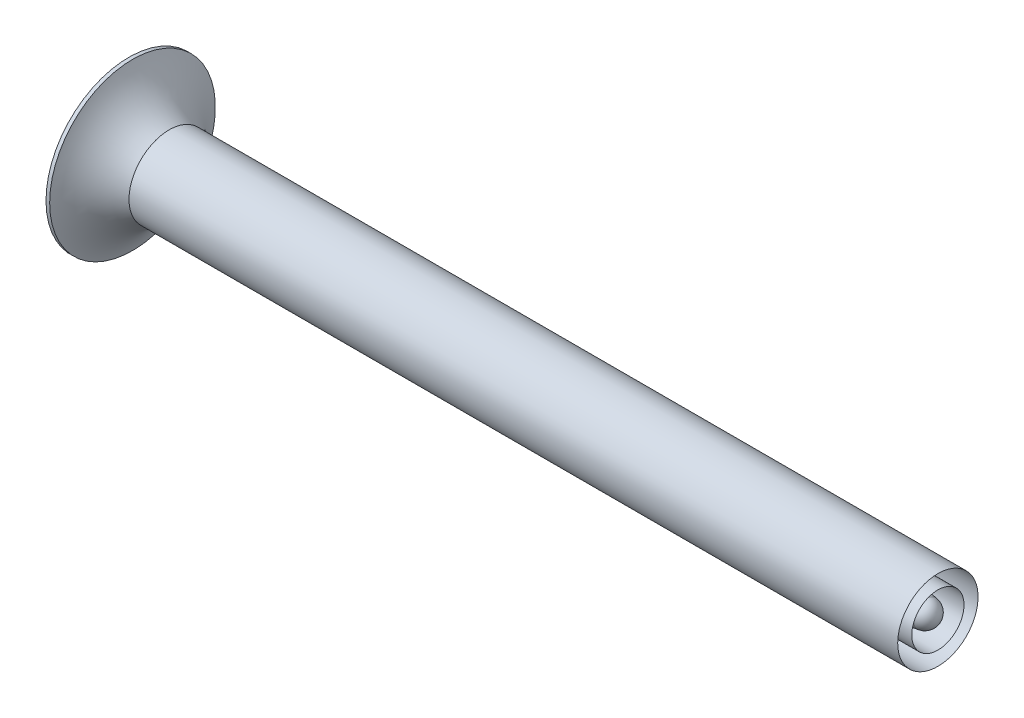
ISO-10303-21;
HEADER;
FILE_DESCRIPTION(('STEP AP214'),'2;1');
FILE_NAME('part.step','',(''),(''),'','','');
FILE_SCHEMA(('AUTOMOTIVE_DESIGN { 1 0 10303 214 1 1 1 1 }'));
ENDSEC;
DATA;
#1=APPLICATION_CONTEXT('core data for automotive mechanical design processes');
#2=APPLICATION_PROTOCOL_DEFINITION('international standard','automotive_design',2000,#1);
#3=PRODUCT_CONTEXT('',#1,'mechanical');
#4=PRODUCT('Part','Part','',(#3));
#5=PRODUCT_RELATED_PRODUCT_CATEGORY('part','',(#4));
#6=PRODUCT_DEFINITION_FORMATION('','',#4);
#7=PRODUCT_DEFINITION_CONTEXT('part definition',#1,'design');
#8=PRODUCT_DEFINITION('design','',#6,#7);
#9=PRODUCT_DEFINITION_SHAPE('','',#8);
#10=(LENGTH_UNIT() NAMED_UNIT(*) SI_UNIT(.MILLI.,.METRE.));
#11=(NAMED_UNIT(*) PLANE_ANGLE_UNIT() SI_UNIT($,.RADIAN.));
#12=(NAMED_UNIT(*) SI_UNIT($,.STERADIAN.) SOLID_ANGLE_UNIT());
#13=UNCERTAINTY_MEASURE_WITH_UNIT(LENGTH_MEASURE(1.E-05),#10,'distance_accuracy_value','');
#14=(GEOMETRIC_REPRESENTATION_CONTEXT(3) GLOBAL_UNCERTAINTY_ASSIGNED_CONTEXT((#13)) GLOBAL_UNIT_ASSIGNED_CONTEXT((#10,
#11,#12)) REPRESENTATION_CONTEXT('',''));
#15=CARTESIAN_POINT('',(0.,0.,0.));
#16=DIRECTION('',(0.,0.,1.));
#17=DIRECTION('',(1.,0.,0.));
#18=AXIS2_PLACEMENT_3D('',#15,#16,#17);
#19=CARTESIAN_POINT('',(0.,0.,0.));
#20=DIRECTION('',(1.,0.,0.));
#21=DIRECTION('',(0.,0.,-1.));
#22=AXIS2_PLACEMENT_3D('',#19,#20,#21);
#23=CYLINDRICAL_SURFACE('',#22,1.9558);
#24=CARTESIAN_POINT('',(0.,0.,0.));
#25=DIRECTION('',(-1.,0.,0.));
#26=DIRECTION('',(0.,0.,1.));
#27=AXIS2_PLACEMENT_3D('',#24,#25,#26);
#28=CIRCLE('',#27,1.9558);
#29=CARTESIAN_POINT('',(0.,0.,1.9558));
#30=VERTEX_POINT('',#29);
#31=EDGE_CURVE('E60',#30,#30,#28,.T.);
#32=ORIENTED_EDGE('',*,*,#31,.T.);
#33=EDGE_LOOP('',(#32));
#34=FACE_BOUND('',#33,.T.);
#35=CARTESIAN_POINT('',(39.37,0.,0.));
#36=DIRECTION('',(-1.,0.,0.));
#37=DIRECTION('',(0.,0.,1.));
#38=AXIS2_PLACEMENT_3D('',#35,#36,#37);
#39=CIRCLE('',#38,1.9558);
#40=CARTESIAN_POINT('',(39.37,0.,1.9558));
#41=VERTEX_POINT('',#40);
#42=EDGE_CURVE('E11',#41,#41,#39,.T.);
#43=ORIENTED_EDGE('',*,*,#42,.F.);
#44=EDGE_LOOP('',(#43));
#45=FACE_BOUND('',#44,.T.);
#46=ADVANCED_FACE('F56',(#34,#45),#23,.F.);
#47=OPEN_SHELL('',(#46));
#48=SHELL_BASED_SURFACE_MODEL('B2',(#47));
#49=CARTESIAN_POINT('',(0.,0.,0.));
#50=DIRECTION('',(1.,0.,0.));
#51=DIRECTION('',(0.,0.,-1.));
#52=AXIS2_PLACEMENT_3D('',#49,#50,#51);
#53=CYLINDRICAL_SURFACE('',#52,1.27);
#54=CARTESIAN_POINT('',(0.,0.,0.));
#55=DIRECTION('',(1.,0.,0.));
#56=DIRECTION('',(0.,0.,-1.));
#57=AXIS2_PLACEMENT_3D('',#54,#55,#56);
#58=CIRCLE('',#57,1.27);
#59=CARTESIAN_POINT('',(0.,0.,-1.27));
#60=VERTEX_POINT('',#59);
#61=EDGE_CURVE('E94',#60,#60,#58,.T.);
#62=ORIENTED_EDGE('',*,*,#61,.T.);
#63=EDGE_LOOP('',(#62));
#64=FACE_BOUND('',#63,.T.);
#65=CARTESIAN_POINT('',(39.37,0.,0.));
#66=DIRECTION('',(1.,0.,0.));
#67=DIRECTION('',(0.,0.,-1.));
#68=AXIS2_PLACEMENT_3D('',#65,#66,#67);
#69=CIRCLE('',#68,1.27);
#70=CARTESIAN_POINT('',(39.37,0.,-1.27));
#71=VERTEX_POINT('',#70);
#72=EDGE_CURVE('E55',#71,#71,#69,.T.);
#73=ORIENTED_EDGE('',*,*,#72,.F.);
#74=EDGE_LOOP('',(#73));
#75=FACE_BOUND('',#74,.T.);
#76=ADVANCED_FACE('F90',(#64,#75),#53,.T.);
#77=OPEN_SHELL('',(#76));
#78=SHELL_BASED_SURFACE_MODEL('B6',(#77));
#79=CARTESIAN_POINT('',(0.,0.,0.));
#80=DIRECTION('',(-1.,0.,0.));
#81=DIRECTION('',(0.,0.,1.));
#82=AXIS2_PLACEMENT_3D('',#79,#80,#81);
#83=CYLINDRICAL_SURFACE('',#82,4.03225);
#84=CARTESIAN_POINT('',(0.177800000000001,0.,0.));
#85=DIRECTION('',(-1.,0.,0.));
#86=DIRECTION('',(0.,0.,1.));
#87=AXIS2_PLACEMENT_3D('',#84,#85,#86);
#88=CIRCLE('',#87,4.03225);
#89=CARTESIAN_POINT('',(0.177800000000001,0.,4.03225));
#90=VERTEX_POINT('',#89);
#91=EDGE_CURVE('E142',#90,#90,#88,.T.);
#92=ORIENTED_EDGE('',*,*,#91,.T.);
#93=EDGE_LOOP('',(#92));
#94=FACE_BOUND('',#93,.T.);
#95=CARTESIAN_POINT('',(0.,0.,0.));
#96=DIRECTION('',(-1.,0.,0.));
#97=DIRECTION('',(0.,0.,1.));
#98=AXIS2_PLACEMENT_3D('',#95,#96,#97);
#99=CIRCLE('',#98,4.03225);
#100=CARTESIAN_POINT('',(0.,0.,4.03225));
#101=VERTEX_POINT('',#100);
#102=EDGE_CURVE('E89',#101,#101,#99,.T.);
#103=ORIENTED_EDGE('',*,*,#102,.F.);
#104=EDGE_LOOP('',(#103));
#105=FACE_BOUND('',#104,.T.);
#106=ADVANCED_FACE('F117',(#94,#105),#83,.T.);
#107=CARTESIAN_POINT('',(0.,-4.03225,0.));
#108=DIRECTION('',(-1.,0.,0.));
#109=DIRECTION('',(0.,0.,1.));
#110=AXIS2_PLACEMENT_3D('',#107,#108,#109);
#111=PLANE('',#110);
#112=ORIENTED_EDGE('',*,*,#102,.T.);
#113=EDGE_LOOP('',(#112));
#114=FACE_BOUND('',#113,.T.);
#115=ADVANCED_FACE('F160',(#114),#111,.T.);
#116=CARTESIAN_POINT('',(38.735,0.,0.));
#117=DIRECTION('',(-1.,0.,0.));
#118=DIRECTION('',(0.,-1.,0.));
#119=AXIS2_PLACEMENT_3D('',#116,#117,#118);
#120=SPHERICAL_SURFACE('',#119,0.634999999999998);
#121=CARTESIAN_POINT('',(38.8178841320597,0.,0.));
#122=DIRECTION('',(-1.,0.,0.));
#123=DIRECTION('',(0.,0.,1.));
#124=AXIS2_PLACEMENT_3D('',#121,#122,#123);
#125=CIRCLE('',#124,0.629567486972368);
#126=CARTESIAN_POINT('',(38.8178841320597,0.,0.629567486972368));
#127=VERTEX_POINT('',#126);
#128=EDGE_CURVE('E123',#127,#127,#125,.T.);
#129=ORIENTED_EDGE('',*,*,#128,.F.);
#130=EDGE_LOOP('',(#129));
#131=FACE_BOUND('',#130,.T.);
#132=ADVANCED_FACE('F164',(#131),#120,.T.);
#133=CARTESIAN_POINT('',(33.9533162373071,0.,0.));
#134=DIRECTION('',(-1.,0.,0.));
#135=DIRECTION('',(0.,0.,1.));
#136=AXIS2_PLACEMENT_3D('',#133,#134,#135);
#137=CONICAL_SURFACE('',#136,1.27,0.130899693899572);
#138=ORIENTED_EDGE('',*,*,#128,.T.);
#139=EDGE_LOOP('',(#138));
#140=FACE_BOUND('',#139,.T.);
#141=CARTESIAN_POINT('',(33.9533162373071,0.,0.));
#142=DIRECTION('',(-1.,0.,0.));
#143=DIRECTION('',(0.,0.,1.));
#144=AXIS2_PLACEMENT_3D('',#141,#142,#143);
#145=CIRCLE('',#144,1.27);
#146=CARTESIAN_POINT('',(33.9533162373071,0.,1.27));
#147=VERTEX_POINT('',#146);
#148=EDGE_CURVE('E127',#147,#147,#145,.T.);
#149=ORIENTED_EDGE('',*,*,#148,.F.);
#150=EDGE_LOOP('',(#149));
#151=FACE_BOUND('',#150,.T.);
#152=ADVANCED_FACE('F168',(#140,#151),#137,.T.);
#153=CARTESIAN_POINT('',(0.,0.,0.));
#154=DIRECTION('',(-1.,0.,0.));
#155=DIRECTION('',(0.,0.,1.));
#156=AXIS2_PLACEMENT_3D('',#153,#154,#155);
#157=CYLINDRICAL_SURFACE('',#156,1.27);
#158=ORIENTED_EDGE('',*,*,#148,.T.);
#159=EDGE_LOOP('',(#158));
#160=FACE_BOUND('',#159,.T.);
#161=CARTESIAN_POINT('',(17.9569911584741,0.,0.));
#162=DIRECTION('',(-1.,0.,0.));
#163=DIRECTION('',(0.,0.,1.));
#164=AXIS2_PLACEMENT_3D('',#161,#162,#163);
#165=CIRCLE('',#164,1.27);
#166=CARTESIAN_POINT('',(17.9569911584741,0.,1.27));
#167=VERTEX_POINT('',#166);
#168=EDGE_CURVE('E131',#167,#167,#165,.T.);
#169=ORIENTED_EDGE('',*,*,#168,.F.);
#170=EDGE_LOOP('',(#169));
#171=FACE_BOUND('',#170,.T.);
#172=ADVANCED_FACE('F174',(#160,#171),#157,.T.);
#173=CARTESIAN_POINT('',(16.51,0.,0.));
#174=DIRECTION('',(-1.,0.,0.));
#175=DIRECTION('',(0.,0.,1.));
#176=AXIS2_PLACEMENT_3D('',#173,#174,#175);
#177=CONICAL_SURFACE('',#176,1.4605,0.130899693899576);
#178=ORIENTED_EDGE('',*,*,#168,.T.);
#179=EDGE_LOOP('',(#178));
#180=FACE_BOUND('',#179,.T.);
#181=CARTESIAN_POINT('',(16.51,0.,0.));
#182=DIRECTION('',(-1.,0.,0.));
#183=DIRECTION('',(0.,0.,1.));
#184=AXIS2_PLACEMENT_3D('',#181,#182,#183);
#185=CIRCLE('',#184,1.4605);
#186=CARTESIAN_POINT('',(16.51,0.,1.4605));
#187=VERTEX_POINT('',#186);
#188=EDGE_CURVE('E136',#187,#187,#185,.T.);
#189=ORIENTED_EDGE('',*,*,#188,.F.);
#190=EDGE_LOOP('',(#189));
#191=FACE_BOUND('',#190,.T.);
#192=ADVANCED_FACE('F156',(#180,#191),#177,.T.);
#193=CARTESIAN_POINT('',(0.,0.,0.));
#194=DIRECTION('',(-1.,0.,0.));
#195=DIRECTION('',(0.,0.,1.));
#196=AXIS2_PLACEMENT_3D('',#193,#194,#195);
#197=CYLINDRICAL_SURFACE('',#196,1.4605);
#198=ORIENTED_EDGE('',*,*,#188,.T.);
#199=EDGE_LOOP('',(#198));
#200=FACE_BOUND('',#199,.T.);
#201=CARTESIAN_POINT('',(3.8608,0.,0.));
#202=DIRECTION('',(-1.,0.,0.));
#203=DIRECTION('',(0.,0.,1.));
#204=AXIS2_PLACEMENT_3D('',#201,#202,#203);
#205=CIRCLE('',#204,1.4605);
#206=CARTESIAN_POINT('',(3.8608,0.,1.4605));
#207=VERTEX_POINT('',#206);
#208=EDGE_CURVE('E139',#207,#207,#205,.T.);
#209=ORIENTED_EDGE('',*,*,#208,.F.);
#210=EDGE_LOOP('',(#209));
#211=FACE_BOUND('',#210,.T.);
#212=ADVANCED_FACE('F150',(#200,#211),#197,.T.);
#213=CARTESIAN_POINT('',(3.8608,0.,0.));
#214=DIRECTION('',(-1.,0.,0.));
#215=DIRECTION('',(0.,0.,1.));
#216=AXIS2_PLACEMENT_3D('',#213,#214,#215);
#217=TOROIDAL_SURFACE('',#216,5.38358487654321,3.92308487654321);
#218=ORIENTED_EDGE('',*,*,#208,.T.);
#219=EDGE_LOOP('',(#218));
#220=FACE_BOUND('',#219,.T.);
#221=ORIENTED_EDGE('',*,*,#91,.F.);
#222=EDGE_LOOP('',(#221));
#223=FACE_BOUND('',#222,.T.);
#224=ADVANCED_FACE('F148',(#220,#223),#217,.F.);
#225=CLOSED_SHELL('',(#106,#115,#132,#152,#172,#192,#212,#224));
#226=MANIFOLD_SOLID_BREP('B50',#225);
#227=ADVANCED_BREP_SHAPE_REPRESENTATION('',(#18,#226),#14);
#228=MANIFOLD_SURFACE_SHAPE_REPRESENTATION('',(#18,#48,#78),#14);
#229=SHAPE_REPRESENTATION('',(#18),#14);
#230=SHAPE_DEFINITION_REPRESENTATION(#9,#229);
#231=SHAPE_REPRESENTATION_RELATIONSHIP('','',#229,#227);
#232=SHAPE_REPRESENTATION_RELATIONSHIP('','',#229,#228);
ENDSEC;
END-ISO-10303-21;
